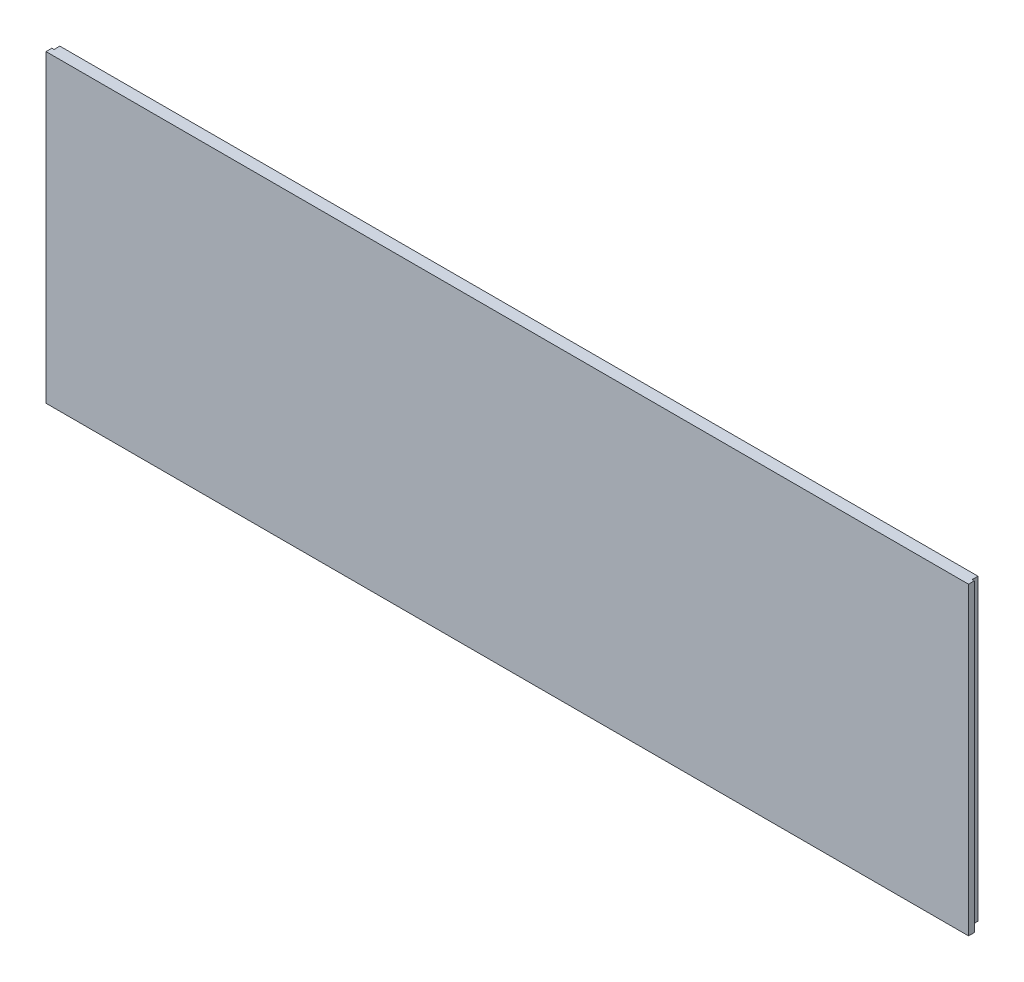
ISO-10303-21;
HEADER;
FILE_DESCRIPTION(('STEP AP214'),'2;1');
FILE_NAME('part.step','',(''),(''),'','','');
FILE_SCHEMA(('AUTOMOTIVE_DESIGN { 1 0 10303 214 1 1 1 1 }'));
ENDSEC;
DATA;
#1=APPLICATION_CONTEXT('core data for automotive mechanical design processes');
#2=APPLICATION_PROTOCOL_DEFINITION('international standard','automotive_design',2000,#1);
#3=PRODUCT_CONTEXT('',#1,'mechanical');
#4=PRODUCT('Part','Part','',(#3));
#5=PRODUCT_RELATED_PRODUCT_CATEGORY('part','',(#4));
#6=PRODUCT_DEFINITION_FORMATION('','',#4);
#7=PRODUCT_DEFINITION_CONTEXT('part definition',#1,'design');
#8=PRODUCT_DEFINITION('design','',#6,#7);
#9=PRODUCT_DEFINITION_SHAPE('','',#8);
#10=(LENGTH_UNIT() NAMED_UNIT(*) SI_UNIT(.MILLI.,.METRE.));
#11=(NAMED_UNIT(*) PLANE_ANGLE_UNIT() SI_UNIT($,.RADIAN.));
#12=(NAMED_UNIT(*) SI_UNIT($,.STERADIAN.) SOLID_ANGLE_UNIT());
#13=UNCERTAINTY_MEASURE_WITH_UNIT(LENGTH_MEASURE(1.E-05),#10,'distance_accuracy_value','');
#14=(GEOMETRIC_REPRESENTATION_CONTEXT(3) GLOBAL_UNCERTAINTY_ASSIGNED_CONTEXT((#13)) GLOBAL_UNIT_ASSIGNED_CONTEXT((#10,
#11,#12)) REPRESENTATION_CONTEXT('',''));
#15=CARTESIAN_POINT('',(0.,0.,0.));
#16=DIRECTION('',(0.,0.,1.));
#17=DIRECTION('',(1.,0.,0.));
#18=AXIS2_PLACEMENT_3D('',#15,#16,#17);
#19=CARTESIAN_POINT('',(0.,0.,0.));
#20=DIRECTION('',(0.,0.,1.));
#21=DIRECTION('',(1.,0.,0.));
#22=AXIS2_PLACEMENT_3D('',#19,#20,#21);
#23=PLANE('',#22);
#24=DIRECTION('',(0.,-1.,0.));
#25=VECTOR('',#24,1.);
#26=CARTESIAN_POINT('',(35.,-50.25,0.));
#27=LINE('',#26,#25);
#28=CARTESIAN_POINT('',(35.,-50.25,0.));
#29=VERTEX_POINT('',#28);
#30=CARTESIAN_POINT('',(35.,-52.25,0.));
#31=VERTEX_POINT('',#30);
#32=EDGE_CURVE('E154',#29,#31,#27,.T.);
#33=ORIENTED_EDGE('',*,*,#32,.F.);
#34=DIRECTION('',(-1.,0.,0.));
#35=VECTOR('',#34,1.);
#36=CARTESIAN_POINT('',(157.5,-50.25,0.));
#37=LINE('',#36,#35);
#38=CARTESIAN_POINT('',(157.5,-50.25,0.));
#39=VERTEX_POINT('',#38);
#40=EDGE_CURVE('E63',#39,#29,#37,.T.);
#41=ORIENTED_EDGE('',*,*,#40,.F.);
#42=DIRECTION('',(0.,-1.,0.));
#43=VECTOR('',#42,1.);
#44=CARTESIAN_POINT('',(157.5,52.25,0.));
#45=LINE('',#44,#43);
#46=CARTESIAN_POINT('',(157.5,52.25,0.));
#47=VERTEX_POINT('',#46);
#48=EDGE_CURVE('E178',#47,#39,#45,.T.);
#49=ORIENTED_EDGE('',*,*,#48,.F.);
#50=DIRECTION('',(-1.,0.,0.));
#51=VECTOR('',#50,1.);
#52=CARTESIAN_POINT('',(-158.25,52.25,0.));
#53=LINE('',#52,#51);
#54=CARTESIAN_POINT('',(158.25,52.25,0.));
#55=VERTEX_POINT('',#54);
#56=EDGE_CURVE('E236',#55,#47,#53,.T.);
#57=ORIENTED_EDGE('',*,*,#56,.F.);
#58=DIRECTION('',(0.,1.,0.));
#59=VECTOR('',#58,1.);
#60=CARTESIAN_POINT('',(158.25,52.25,0.));
#61=LINE('',#60,#59);
#62=CARTESIAN_POINT('',(158.25,-52.25,0.));
#63=VERTEX_POINT('',#62);
#64=EDGE_CURVE('E216',#63,#55,#61,.T.);
#65=ORIENTED_EDGE('',*,*,#64,.F.);
#66=DIRECTION('',(1.,0.,0.));
#67=VECTOR('',#66,1.);
#68=CARTESIAN_POINT('',(-158.25,-52.25,0.));
#69=LINE('',#68,#67);
#70=EDGE_CURVE('E243',#31,#63,#69,.T.);
#71=ORIENTED_EDGE('',*,*,#70,.F.);
#72=EDGE_LOOP('',(#33,#41,#49,#57,#65,#71));
#73=FACE_BOUND('',#72,.T.);
#74=ADVANCED_FACE('F39',(#73),#23,.F.);
#75=DIRECTION('',(0.,1.,0.));
#76=VECTOR('',#75,1.);
#77=CARTESIAN_POINT('',(-35.,-50.25,0.));
#78=LINE('',#77,#76);
#79=CARTESIAN_POINT('',(-35.,-52.25,0.));
#80=VERTEX_POINT('',#79);
#81=CARTESIAN_POINT('',(-35.,-50.25,0.));
#82=VERTEX_POINT('',#81);
#83=EDGE_CURVE('E170',#80,#82,#78,.T.);
#84=ORIENTED_EDGE('',*,*,#83,.F.);
#85=CARTESIAN_POINT('',(-158.25,-52.25,0.));
#86=VERTEX_POINT('',#85);
#87=EDGE_CURVE('E222',#86,#80,#69,.T.);
#88=ORIENTED_EDGE('',*,*,#87,.F.);
#89=DIRECTION('',(0.,-1.,0.));
#90=VECTOR('',#89,1.);
#91=CARTESIAN_POINT('',(-158.25,52.25,0.));
#92=LINE('',#91,#90);
#93=CARTESIAN_POINT('',(-158.25,52.25,0.));
#94=VERTEX_POINT('',#93);
#95=EDGE_CURVE('E240',#94,#86,#92,.T.);
#96=ORIENTED_EDGE('',*,*,#95,.F.);
#97=CARTESIAN_POINT('',(-157.5,52.25,0.));
#98=VERTEX_POINT('',#97);
#99=EDGE_CURVE('E235',#98,#94,#53,.T.);
#100=ORIENTED_EDGE('',*,*,#99,.F.);
#101=DIRECTION('',(0.,1.,0.));
#102=VECTOR('',#101,1.);
#103=CARTESIAN_POINT('',(-157.5,52.25,0.));
#104=LINE('',#103,#102);
#105=CARTESIAN_POINT('',(-157.5,-50.25,0.));
#106=VERTEX_POINT('',#105);
#107=EDGE_CURVE('E183',#106,#98,#104,.T.);
#108=ORIENTED_EDGE('',*,*,#107,.F.);
#109=EDGE_CURVE('E196',#82,#106,#37,.T.);
#110=ORIENTED_EDGE('',*,*,#109,.F.);
#111=EDGE_LOOP('',(#84,#88,#96,#100,#108,#110));
#112=FACE_BOUND('',#111,.T.);
#113=ADVANCED_FACE('F265',(#112),#23,.F.);
#114=CARTESIAN_POINT('',(157.5,-50.25,-2.));
#115=DIRECTION('',(0.,1.,0.));
#116=DIRECTION('',(0.,0.,1.));
#117=AXIS2_PLACEMENT_3D('',#114,#115,#116);
#118=PLANE('',#117);
#119=DIRECTION('',(0.,0.,1.));
#120=VECTOR('',#119,1.);
#121=CARTESIAN_POINT('',(35.,-50.25,-72.1141925718324));
#122=LINE('',#121,#120);
#123=CARTESIAN_POINT('',(35.,-50.25,-2.));
#124=VERTEX_POINT('',#123);
#125=EDGE_CURVE('E172',#124,#29,#122,.T.);
#126=ORIENTED_EDGE('',*,*,#125,.F.);
#127=DIRECTION('',(-1.,0.,0.));
#128=VECTOR('',#127,1.);
#129=CARTESIAN_POINT('',(157.5,-50.25,-2.));
#130=LINE('',#129,#128);
#131=CARTESIAN_POINT('',(157.5,-50.25,-2.));
#132=VERTEX_POINT('',#131);
#133=EDGE_CURVE('E159',#132,#124,#130,.T.);
#134=ORIENTED_EDGE('',*,*,#133,.F.);
#135=DIRECTION('',(0.,0.,1.));
#136=VECTOR('',#135,1.);
#137=CARTESIAN_POINT('',(157.5,-50.25,-2.));
#138=LINE('',#137,#136);
#139=EDGE_CURVE('E213',#132,#39,#138,.T.);
#140=ORIENTED_EDGE('',*,*,#139,.T.);
#141=ORIENTED_EDGE('',*,*,#40,.T.);
#142=EDGE_LOOP('',(#126,#134,#140,#141));
#143=FACE_BOUND('',#142,.T.);
#144=ADVANCED_FACE('F312',(#143),#118,.F.);
#145=DIRECTION('',(0.,0.,1.));
#146=VECTOR('',#145,1.);
#147=CARTESIAN_POINT('',(-35.,-50.25,-72.1141925718324));
#148=LINE('',#147,#146);
#149=CARTESIAN_POINT('',(-35.,-50.25,-2.));
#150=VERTEX_POINT('',#149);
#151=EDGE_CURVE('E161',#150,#82,#148,.T.);
#152=ORIENTED_EDGE('',*,*,#151,.T.);
#153=ORIENTED_EDGE('',*,*,#109,.T.);
#154=DIRECTION('',(0.,0.,1.));
#155=VECTOR('',#154,1.);
#156=CARTESIAN_POINT('',(-157.5,-50.25,-2.));
#157=LINE('',#156,#155);
#158=CARTESIAN_POINT('',(-157.5,-50.25,-2.));
#159=VERTEX_POINT('',#158);
#160=EDGE_CURVE('E209',#159,#106,#157,.T.);
#161=ORIENTED_EDGE('',*,*,#160,.F.);
#162=EDGE_CURVE('E182',#150,#159,#130,.T.);
#163=ORIENTED_EDGE('',*,*,#162,.F.);
#164=EDGE_LOOP('',(#152,#153,#161,#163));
#165=FACE_BOUND('',#164,.T.);
#166=ADVANCED_FACE('F307',(#165),#118,.F.);
#167=CARTESIAN_POINT('',(158.25,52.25,2.));
#168=DIRECTION('',(-1.,0.,0.));
#169=DIRECTION('',(0.,0.,1.));
#170=AXIS2_PLACEMENT_3D('',#167,#168,#169);
#171=PLANE('',#170);
#172=ORIENTED_EDGE('',*,*,#64,.T.);
#173=DIRECTION('',(0.,0.,-1.));
#174=VECTOR('',#173,1.);
#175=CARTESIAN_POINT('',(158.25,52.25,2.));
#176=LINE('',#175,#174);
#177=CARTESIAN_POINT('',(158.25,52.25,2.));
#178=VERTEX_POINT('',#177);
#179=EDGE_CURVE('E11',#178,#55,#176,.T.);
#180=ORIENTED_EDGE('',*,*,#179,.F.);
#181=DIRECTION('',(0.,1.,0.));
#182=VECTOR('',#181,1.);
#183=CARTESIAN_POINT('',(158.25,52.25,2.));
#184=LINE('',#183,#182);
#185=CARTESIAN_POINT('',(158.25,-52.25,2.));
#186=VERTEX_POINT('',#185);
#187=EDGE_CURVE('E217',#186,#178,#184,.T.);
#188=ORIENTED_EDGE('',*,*,#187,.F.);
#189=DIRECTION('',(0.,0.,-1.));
#190=VECTOR('',#189,1.);
#191=CARTESIAN_POINT('',(158.25,-52.25,2.));
#192=LINE('',#191,#190);
#193=EDGE_CURVE('E231',#186,#63,#192,.T.);
#194=ORIENTED_EDGE('',*,*,#193,.T.);
#195=EDGE_LOOP('',(#172,#180,#188,#194));
#196=FACE_BOUND('',#195,.T.);
#197=ADVANCED_FACE('F41',(#196),#171,.F.);
#198=CARTESIAN_POINT('',(-158.25,52.25,2.));
#199=DIRECTION('',(0.,-1.,0.));
#200=DIRECTION('',(0.,0.,-1.));
#201=AXIS2_PLACEMENT_3D('',#198,#199,#200);
#202=PLANE('',#201);
#203=ORIENTED_EDGE('',*,*,#56,.T.);
#204=DIRECTION('',(0.,0.,1.));
#205=VECTOR('',#204,1.);
#206=CARTESIAN_POINT('',(157.5,52.25,-2.));
#207=LINE('',#206,#205);
#208=CARTESIAN_POINT('',(157.5,52.25,-2.));
#209=VERTEX_POINT('',#208);
#210=EDGE_CURVE('E192',#209,#47,#207,.T.);
#211=ORIENTED_EDGE('',*,*,#210,.F.);
#212=DIRECTION('',(1.,0.,0.));
#213=VECTOR('',#212,1.);
#214=CARTESIAN_POINT('',(157.5,52.25,-2.));
#215=LINE('',#214,#213);
#216=CARTESIAN_POINT('',(-157.5,52.25,-2.));
#217=VERTEX_POINT('',#216);
#218=EDGE_CURVE('E189',#217,#209,#215,.T.);
#219=ORIENTED_EDGE('',*,*,#218,.F.);
#220=DIRECTION('',(0.,0.,1.));
#221=VECTOR('',#220,1.);
#222=CARTESIAN_POINT('',(-157.5,52.25,-2.));
#223=LINE('',#222,#221);
#224=EDGE_CURVE('E205',#217,#98,#223,.T.);
#225=ORIENTED_EDGE('',*,*,#224,.T.);
#226=ORIENTED_EDGE('',*,*,#99,.T.);
#227=DIRECTION('',(0.,0.,-1.));
#228=VECTOR('',#227,1.);
#229=CARTESIAN_POINT('',(-158.25,52.25,2.));
#230=LINE('',#229,#228);
#231=CARTESIAN_POINT('',(-158.25,52.25,2.));
#232=VERTEX_POINT('',#231);
#233=EDGE_CURVE('E48',#232,#94,#230,.T.);
#234=ORIENTED_EDGE('',*,*,#233,.F.);
#235=DIRECTION('',(-1.,0.,0.));
#236=VECTOR('',#235,1.);
#237=CARTESIAN_POINT('',(-158.25,52.25,2.));
#238=LINE('',#237,#236);
#239=EDGE_CURVE('E221',#178,#232,#238,.T.);
#240=ORIENTED_EDGE('',*,*,#239,.F.);
#241=ORIENTED_EDGE('',*,*,#179,.T.);
#242=EDGE_LOOP('',(#203,#211,#219,#225,#226,#234,#240,#241));
#243=FACE_BOUND('',#242,.T.);
#244=ADVANCED_FACE('F277',(#243),#202,.F.);
#245=CARTESIAN_POINT('',(-158.25,52.25,2.));
#246=DIRECTION('',(1.,0.,0.));
#247=DIRECTION('',(0.,0.,-1.));
#248=AXIS2_PLACEMENT_3D('',#245,#246,#247);
#249=PLANE('',#248);
#250=ORIENTED_EDGE('',*,*,#95,.T.);
#251=DIRECTION('',(0.,0.,-1.));
#252=VECTOR('',#251,1.);
#253=CARTESIAN_POINT('',(-158.25,-52.25,2.));
#254=LINE('',#253,#252);
#255=CARTESIAN_POINT('',(-158.25,-52.25,2.));
#256=VERTEX_POINT('',#255);
#257=EDGE_CURVE('E250',#256,#86,#254,.T.);
#258=ORIENTED_EDGE('',*,*,#257,.F.);
#259=DIRECTION('',(0.,-1.,0.));
#260=VECTOR('',#259,1.);
#261=CARTESIAN_POINT('',(-158.25,52.25,2.));
#262=LINE('',#261,#260);
#263=EDGE_CURVE('E225',#232,#256,#262,.T.);
#264=ORIENTED_EDGE('',*,*,#263,.F.);
#265=ORIENTED_EDGE('',*,*,#233,.T.);
#266=EDGE_LOOP('',(#250,#258,#264,#265));
#267=FACE_BOUND('',#266,.T.);
#268=ADVANCED_FACE('F259',(#267),#249,.F.);
#269=CARTESIAN_POINT('',(-158.25,-52.25,2.));
#270=DIRECTION('',(0.,1.,0.));
#271=DIRECTION('',(0.,0.,1.));
#272=AXIS2_PLACEMENT_3D('',#269,#270,#271);
#273=PLANE('',#272);
#274=ORIENTED_EDGE('',*,*,#87,.T.);
#275=DIRECTION('',(-1.,0.,0.));
#276=VECTOR('',#275,1.);
#277=CARTESIAN_POINT('',(-158.25,-52.25,0.));
#278=LINE('',#277,#276);
#279=EDGE_CURVE('E175',#31,#80,#278,.T.);
#280=ORIENTED_EDGE('',*,*,#279,.F.);
#281=ORIENTED_EDGE('',*,*,#70,.T.);
#282=ORIENTED_EDGE('',*,*,#193,.F.);
#283=DIRECTION('',(1.,0.,0.));
#284=VECTOR('',#283,1.);
#285=CARTESIAN_POINT('',(-158.25,-52.25,2.));
#286=LINE('',#285,#284);
#287=EDGE_CURVE('E228',#256,#186,#286,.T.);
#288=ORIENTED_EDGE('',*,*,#287,.F.);
#289=ORIENTED_EDGE('',*,*,#257,.T.);
#290=EDGE_LOOP('',(#274,#280,#281,#282,#288,#289));
#291=FACE_BOUND('',#290,.T.);
#292=ADVANCED_FACE('F270',(#291),#273,.F.);
#293=CARTESIAN_POINT('',(0.,0.,2.));
#294=DIRECTION('',(0.,0.,1.));
#295=DIRECTION('',(1.,0.,0.));
#296=AXIS2_PLACEMENT_3D('',#293,#294,#295);
#297=PLANE('',#296);
#298=ORIENTED_EDGE('',*,*,#187,.T.);
#299=ORIENTED_EDGE('',*,*,#239,.T.);
#300=ORIENTED_EDGE('',*,*,#263,.T.);
#301=ORIENTED_EDGE('',*,*,#287,.T.);
#302=EDGE_LOOP('',(#298,#299,#300,#301));
#303=FACE_BOUND('',#302,.T.);
#304=ADVANCED_FACE('F275',(#303),#297,.T.);
#305=CARTESIAN_POINT('',(157.5,52.25,-2.));
#306=DIRECTION('',(-1.,0.,0.));
#307=DIRECTION('',(0.,0.,1.));
#308=AXIS2_PLACEMENT_3D('',#305,#306,#307);
#309=PLANE('',#308);
#310=ORIENTED_EDGE('',*,*,#48,.T.);
#311=ORIENTED_EDGE('',*,*,#139,.F.);
#312=DIRECTION('',(0.,-1.,0.));
#313=VECTOR('',#312,1.);
#314=CARTESIAN_POINT('',(157.5,52.25,-2.));
#315=LINE('',#314,#313);
#316=EDGE_CURVE('E179',#209,#132,#315,.T.);
#317=ORIENTED_EDGE('',*,*,#316,.F.);
#318=ORIENTED_EDGE('',*,*,#210,.T.);
#319=EDGE_LOOP('',(#310,#311,#317,#318));
#320=FACE_BOUND('',#319,.T.);
#321=ADVANCED_FACE('F284',(#320),#309,.F.);
#322=CARTESIAN_POINT('',(-157.5,52.25,-2.));
#323=DIRECTION('',(1.,0.,0.));
#324=DIRECTION('',(0.,0.,-1.));
#325=AXIS2_PLACEMENT_3D('',#322,#323,#324);
#326=PLANE('',#325);
#327=ORIENTED_EDGE('',*,*,#107,.T.);
#328=ORIENTED_EDGE('',*,*,#224,.F.);
#329=DIRECTION('',(0.,1.,0.));
#330=VECTOR('',#329,1.);
#331=CARTESIAN_POINT('',(-157.5,52.25,-2.));
#332=LINE('',#331,#330);
#333=EDGE_CURVE('E186',#159,#217,#332,.T.);
#334=ORIENTED_EDGE('',*,*,#333,.F.);
#335=ORIENTED_EDGE('',*,*,#160,.T.);
#336=EDGE_LOOP('',(#327,#328,#334,#335));
#337=FACE_BOUND('',#336,.T.);
#338=ADVANCED_FACE('F292',(#337),#326,.F.);
#339=CARTESIAN_POINT('',(0.,0.,-2.));
#340=DIRECTION('',(0.,0.,-1.));
#341=DIRECTION('',(-1.,0.,0.));
#342=AXIS2_PLACEMENT_3D('',#339,#340,#341);
#343=PLANE('',#342);
#344=ORIENTED_EDGE('',*,*,#316,.T.);
#345=ORIENTED_EDGE('',*,*,#133,.T.);
#346=DIRECTION('',(0.,-1.,0.));
#347=VECTOR('',#346,1.);
#348=CARTESIAN_POINT('',(35.,-50.25,-2.));
#349=LINE('',#348,#347);
#350=CARTESIAN_POINT('',(35.,-54.25,-2.));
#351=VERTEX_POINT('',#350);
#352=EDGE_CURVE('E145',#124,#351,#349,.T.);
#353=ORIENTED_EDGE('',*,*,#352,.T.);
#354=DIRECTION('',(-1.,0.,0.));
#355=VECTOR('',#354,1.);
#356=CARTESIAN_POINT('',(35.,-54.25,-2.));
#357=LINE('',#356,#355);
#358=CARTESIAN_POINT('',(-35.,-54.25,-2.));
#359=VERTEX_POINT('',#358);
#360=EDGE_CURVE('E136',#351,#359,#357,.T.);
#361=ORIENTED_EDGE('',*,*,#360,.T.);
#362=DIRECTION('',(0.,1.,0.));
#363=VECTOR('',#362,1.);
#364=CARTESIAN_POINT('',(-35.,-50.25,-2.));
#365=LINE('',#364,#363);
#366=EDGE_CURVE('E55',#359,#150,#365,.T.);
#367=ORIENTED_EDGE('',*,*,#366,.T.);
#368=ORIENTED_EDGE('',*,*,#162,.T.);
#369=ORIENTED_EDGE('',*,*,#333,.T.);
#370=ORIENTED_EDGE('',*,*,#218,.T.);
#371=EDGE_LOOP('',(#344,#345,#353,#361,#367,#368,#369,#370));
#372=FACE_BOUND('',#371,.T.);
#373=ADVANCED_FACE('F158',(#372),#343,.T.);
#374=CARTESIAN_POINT('',(0.,0.,0.));
#375=DIRECTION('',(0.,0.,-1.));
#376=DIRECTION('',(-1.,0.,0.));
#377=AXIS2_PLACEMENT_3D('',#374,#375,#376);
#378=PLANE('',#377);
#379=CARTESIAN_POINT('',(35.,-54.25,0.));
#380=VERTEX_POINT('',#379);
#381=EDGE_CURVE('E151',#31,#380,#27,.T.);
#382=ORIENTED_EDGE('',*,*,#381,.F.);
#383=ORIENTED_EDGE('',*,*,#279,.T.);
#384=CARTESIAN_POINT('',(-35.,-54.25,0.));
#385=VERTEX_POINT('',#384);
#386=EDGE_CURVE('E165',#385,#80,#78,.T.);
#387=ORIENTED_EDGE('',*,*,#386,.F.);
#388=DIRECTION('',(-1.,0.,0.));
#389=VECTOR('',#388,1.);
#390=CARTESIAN_POINT('',(35.,-54.25,0.));
#391=LINE('',#390,#389);
#392=EDGE_CURVE('E153',#380,#385,#391,.T.);
#393=ORIENTED_EDGE('',*,*,#392,.F.);
#394=EDGE_LOOP('',(#382,#383,#387,#393));
#395=FACE_BOUND('',#394,.T.);
#396=ADVANCED_FACE('F365',(#395),#378,.F.);
#397=CARTESIAN_POINT('',(35.,-50.25,-72.1141925718324));
#398=DIRECTION('',(-1.,0.,0.));
#399=DIRECTION('',(0.,0.,1.));
#400=AXIS2_PLACEMENT_3D('',#397,#398,#399);
#401=PLANE('',#400);
#402=ORIENTED_EDGE('',*,*,#352,.F.);
#403=ORIENTED_EDGE('',*,*,#125,.T.);
#404=ORIENTED_EDGE('',*,*,#32,.T.);
#405=ORIENTED_EDGE('',*,*,#381,.T.);
#406=DIRECTION('',(0.,0.,1.));
#407=VECTOR('',#406,1.);
#408=CARTESIAN_POINT('',(35.,-54.25,-72.1141925718324));
#409=LINE('',#408,#407);
#410=EDGE_CURVE('E140',#351,#380,#409,.T.);
#411=ORIENTED_EDGE('',*,*,#410,.F.);
#412=EDGE_LOOP('',(#402,#403,#404,#405,#411));
#413=FACE_BOUND('',#412,.T.);
#414=ADVANCED_FACE('F148',(#413),#401,.F.);
#415=CARTESIAN_POINT('',(35.,-54.25,-72.1141925718324));
#416=DIRECTION('',(0.,1.,0.));
#417=DIRECTION('',(0.,0.,1.));
#418=AXIS2_PLACEMENT_3D('',#415,#416,#417);
#419=PLANE('',#418);
#420=ORIENTED_EDGE('',*,*,#360,.F.);
#421=ORIENTED_EDGE('',*,*,#410,.T.);
#422=ORIENTED_EDGE('',*,*,#392,.T.);
#423=DIRECTION('',(0.,0.,1.));
#424=VECTOR('',#423,1.);
#425=CARTESIAN_POINT('',(-35.,-54.25,-72.1141925718324));
#426=LINE('',#425,#424);
#427=EDGE_CURVE('E142',#359,#385,#426,.T.);
#428=ORIENTED_EDGE('',*,*,#427,.F.);
#429=EDGE_LOOP('',(#420,#421,#422,#428));
#430=FACE_BOUND('',#429,.T.);
#431=ADVANCED_FACE('F138',(#430),#419,.F.);
#432=CARTESIAN_POINT('',(-35.,-50.25,-72.1141925718324));
#433=DIRECTION('',(1.,0.,0.));
#434=DIRECTION('',(0.,0.,-1.));
#435=AXIS2_PLACEMENT_3D('',#432,#433,#434);
#436=PLANE('',#435);
#437=ORIENTED_EDGE('',*,*,#366,.F.);
#438=ORIENTED_EDGE('',*,*,#427,.T.);
#439=ORIENTED_EDGE('',*,*,#386,.T.);
#440=ORIENTED_EDGE('',*,*,#83,.T.);
#441=ORIENTED_EDGE('',*,*,#151,.F.);
#442=EDGE_LOOP('',(#437,#438,#439,#440,#441));
#443=FACE_BOUND('',#442,.T.);
#444=ADVANCED_FACE('F306',(#443),#436,.F.);
#445=CLOSED_SHELL('',(#74,#113,#144,#166,#197,#244,#268,#292,#304,#321,#338,#373,#396,#414,#431,#444));
#446=MANIFOLD_SOLID_BREP('B2',#445);
#447=ADVANCED_BREP_SHAPE_REPRESENTATION('',(#18,#446),#14);
#448=SHAPE_DEFINITION_REPRESENTATION(#9,#447);
ENDSEC;
END-ISO-10303-21;
